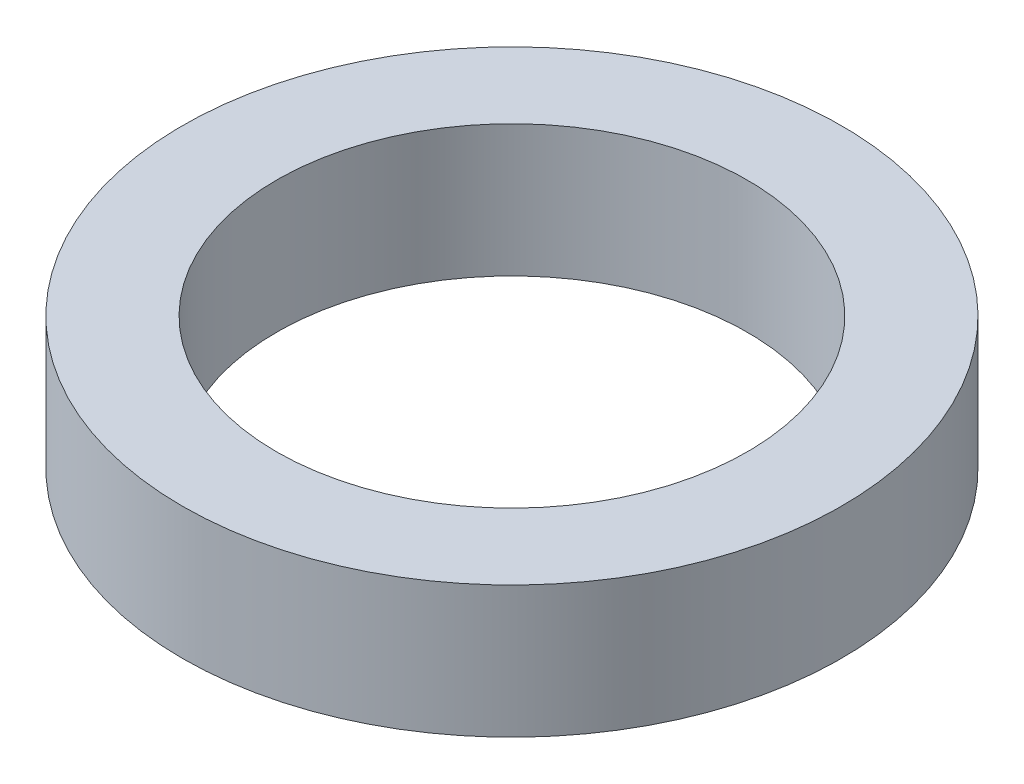
ISO-10303-21;
HEADER;
FILE_DESCRIPTION(('STEP AP214'),'2;1');
FILE_NAME('part.step','',(''),(''),'','','');
FILE_SCHEMA(('AUTOMOTIVE_DESIGN { 1 0 10303 214 1 1 1 1 }'));
ENDSEC;
DATA;
#1=APPLICATION_CONTEXT('core data for automotive mechanical design processes');
#2=APPLICATION_PROTOCOL_DEFINITION('international standard','automotive_design',2000,#1);
#3=PRODUCT_CONTEXT('',#1,'mechanical');
#4=PRODUCT('Part','Part','',(#3));
#5=PRODUCT_RELATED_PRODUCT_CATEGORY('part','',(#4));
#6=PRODUCT_DEFINITION_FORMATION('','',#4);
#7=PRODUCT_DEFINITION_CONTEXT('part definition',#1,'design');
#8=PRODUCT_DEFINITION('design','',#6,#7);
#9=PRODUCT_DEFINITION_SHAPE('','',#8);
#10=(LENGTH_UNIT() NAMED_UNIT(*) SI_UNIT(.MILLI.,.METRE.));
#11=(NAMED_UNIT(*) PLANE_ANGLE_UNIT() SI_UNIT($,.RADIAN.));
#12=(NAMED_UNIT(*) SI_UNIT($,.STERADIAN.) SOLID_ANGLE_UNIT());
#13=UNCERTAINTY_MEASURE_WITH_UNIT(LENGTH_MEASURE(1.E-05),#10,'distance_accuracy_value','');
#14=(GEOMETRIC_REPRESENTATION_CONTEXT(3) GLOBAL_UNCERTAINTY_ASSIGNED_CONTEXT((#13)) GLOBAL_UNIT_ASSIGNED_CONTEXT((#10,
#11,#12)) REPRESENTATION_CONTEXT('',''));
#15=CARTESIAN_POINT('',(0.,0.,0.));
#16=DIRECTION('',(0.,0.,1.));
#17=DIRECTION('',(1.,0.,0.));
#18=AXIS2_PLACEMENT_3D('',#15,#16,#17);
#19=CARTESIAN_POINT('',(0.,14.,0.));
#20=DIRECTION('',(0.,1.,0.));
#21=DIRECTION('',(0.,0.,1.));
#22=AXIS2_PLACEMENT_3D('',#19,#20,#21);
#23=PLANE('',#22);
#24=CARTESIAN_POINT('',(0.,14.,0.));
#25=DIRECTION('',(0.,1.,0.));
#26=DIRECTION('',(0.,0.,1.));
#27=AXIS2_PLACEMENT_3D('',#24,#25,#26);
#28=CIRCLE('',#27,35.);
#29=CARTESIAN_POINT('',(0.,14.,35.));
#30=VERTEX_POINT('',#29);
#31=EDGE_CURVE('E10',#30,#30,#28,.T.);
#32=ORIENTED_EDGE('',*,*,#31,.T.);
#33=EDGE_LOOP('',(#32));
#34=FACE_BOUND('',#33,.T.);
#35=CARTESIAN_POINT('',(0.,14.,0.));
#36=DIRECTION('',(0.,1.,0.));
#37=DIRECTION('',(0.,0.,1.));
#38=AXIS2_PLACEMENT_3D('',#35,#36,#37);
#39=CIRCLE('',#38,25.);
#40=CARTESIAN_POINT('',(0.,14.,25.));
#41=VERTEX_POINT('',#40);
#42=EDGE_CURVE('E50',#41,#41,#39,.T.);
#43=ORIENTED_EDGE('',*,*,#42,.F.);
#44=EDGE_LOOP('',(#43));
#45=FACE_BOUND('',#44,.T.);
#46=ADVANCED_FACE('F37',(#34,#45),#23,.T.);
#47=CARTESIAN_POINT('',(0.,0.,0.));
#48=DIRECTION('',(0.,1.,0.));
#49=DIRECTION('',(0.,0.,1.));
#50=AXIS2_PLACEMENT_3D('',#47,#48,#49);
#51=PLANE('',#50);
#52=CARTESIAN_POINT('',(0.,0.,0.));
#53=DIRECTION('',(0.,1.,0.));
#54=DIRECTION('',(0.,0.,1.));
#55=AXIS2_PLACEMENT_3D('',#52,#53,#54);
#56=CIRCLE('',#55,35.);
#57=CARTESIAN_POINT('',(0.,0.,35.));
#58=VERTEX_POINT('',#57);
#59=EDGE_CURVE('E41',#58,#58,#56,.T.);
#60=ORIENTED_EDGE('',*,*,#59,.F.);
#61=EDGE_LOOP('',(#60));
#62=FACE_BOUND('',#61,.T.);
#63=CARTESIAN_POINT('',(0.,0.,0.));
#64=DIRECTION('',(0.,1.,0.));
#65=DIRECTION('',(0.,0.,1.));
#66=AXIS2_PLACEMENT_3D('',#63,#64,#65);
#67=CIRCLE('',#66,25.);
#68=CARTESIAN_POINT('',(0.,0.,25.));
#69=VERTEX_POINT('',#68);
#70=EDGE_CURVE('E52',#69,#69,#67,.T.);
#71=ORIENTED_EDGE('',*,*,#70,.T.);
#72=EDGE_LOOP('',(#71));
#73=FACE_BOUND('',#72,.T.);
#74=ADVANCED_FACE('F64',(#62,#73),#51,.F.);
#75=CARTESIAN_POINT('',(0.,14.,0.));
#76=DIRECTION('',(0.,-1.,0.));
#77=DIRECTION('',(0.,0.,-1.));
#78=AXIS2_PLACEMENT_3D('',#75,#76,#77);
#79=CYLINDRICAL_SURFACE('',#78,35.);
#80=ORIENTED_EDGE('',*,*,#31,.F.);
#81=EDGE_LOOP('',(#80));
#82=FACE_BOUND('',#81,.T.);
#83=ORIENTED_EDGE('',*,*,#59,.T.);
#84=EDGE_LOOP('',(#83));
#85=FACE_BOUND('',#84,.T.);
#86=ADVANCED_FACE('F39',(#82,#85),#79,.T.);
#87=CARTESIAN_POINT('',(0.,14.,0.));
#88=DIRECTION('',(0.,-1.,0.));
#89=DIRECTION('',(0.,0.,-1.));
#90=AXIS2_PLACEMENT_3D('',#87,#88,#89);
#91=CYLINDRICAL_SURFACE('',#90,25.);
#92=ORIENTED_EDGE('',*,*,#42,.T.);
#93=EDGE_LOOP('',(#92));
#94=FACE_BOUND('',#93,.T.);
#95=ORIENTED_EDGE('',*,*,#70,.F.);
#96=EDGE_LOOP('',(#95));
#97=FACE_BOUND('',#96,.T.);
#98=ADVANCED_FACE('F60',(#94,#97),#91,.F.);
#99=CLOSED_SHELL('',(#46,#74,#86,#98));
#100=MANIFOLD_SOLID_BREP('B2',#99);
#101=ADVANCED_BREP_SHAPE_REPRESENTATION('',(#18,#100),#14);
#102=SHAPE_DEFINITION_REPRESENTATION(#9,#101);
ENDSEC;
END-ISO-10303-21;
